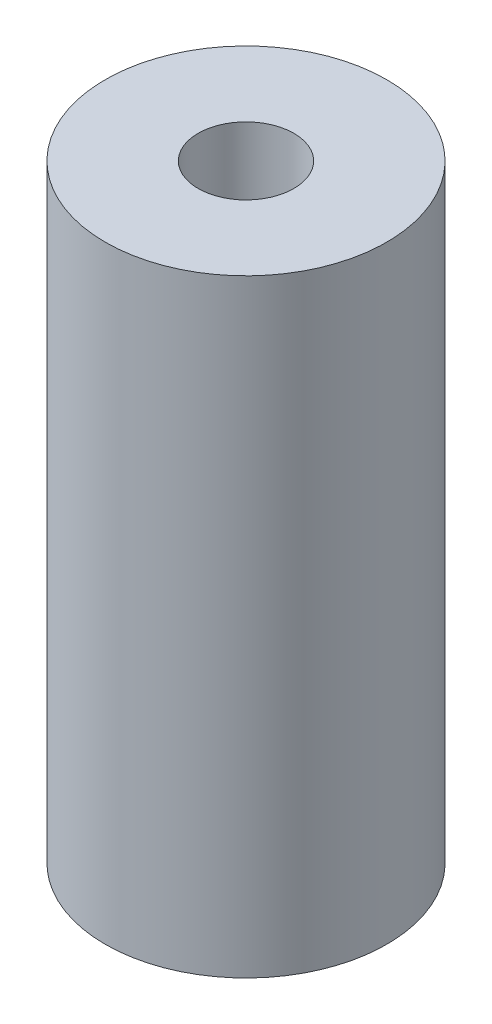
ISO-10303-21;
HEADER;
FILE_DESCRIPTION(('STEP AP214'),'2;1');
FILE_NAME('part.step','',(''),(''),'','','');
FILE_SCHEMA(('AUTOMOTIVE_DESIGN { 1 0 10303 214 1 1 1 1 }'));
ENDSEC;
DATA;
#1=APPLICATION_CONTEXT('core data for automotive mechanical design processes');
#2=APPLICATION_PROTOCOL_DEFINITION('international standard','automotive_design',2000,#1);
#3=PRODUCT_CONTEXT('',#1,'mechanical');
#4=PRODUCT('Part','Part','',(#3));
#5=PRODUCT_RELATED_PRODUCT_CATEGORY('part','',(#4));
#6=PRODUCT_DEFINITION_FORMATION('','',#4);
#7=PRODUCT_DEFINITION_CONTEXT('part definition',#1,'design');
#8=PRODUCT_DEFINITION('design','',#6,#7);
#9=PRODUCT_DEFINITION_SHAPE('','',#8);
#10=(LENGTH_UNIT() NAMED_UNIT(*) SI_UNIT(.MILLI.,.METRE.));
#11=(NAMED_UNIT(*) PLANE_ANGLE_UNIT() SI_UNIT($,.RADIAN.));
#12=(NAMED_UNIT(*) SI_UNIT($,.STERADIAN.) SOLID_ANGLE_UNIT());
#13=UNCERTAINTY_MEASURE_WITH_UNIT(LENGTH_MEASURE(1.E-05),#10,'distance_accuracy_value','');
#14=(GEOMETRIC_REPRESENTATION_CONTEXT(3) GLOBAL_UNCERTAINTY_ASSIGNED_CONTEXT((#13)) GLOBAL_UNIT_ASSIGNED_CONTEXT((#10,
#11,#12)) REPRESENTATION_CONTEXT('',''));
#15=CARTESIAN_POINT('',(0.,0.,0.));
#16=DIRECTION('',(0.,0.,1.));
#17=DIRECTION('',(1.,0.,0.));
#18=AXIS2_PLACEMENT_3D('',#15,#16,#17);
#19=CARTESIAN_POINT('',(12.5087,54.0087,12.5087));
#20=DIRECTION('',(0.,-1.,0.));
#21=DIRECTION('',(0.,0.,-1.));
#22=AXIS2_PLACEMENT_3D('',#19,#20,#21);
#23=CYLINDRICAL_SURFACE('',#22,4.25);
#24=CARTESIAN_POINT('',(12.5087,54.0087,12.5087));
#25=DIRECTION('',(0.,-1.,0.));
#26=DIRECTION('',(0.,0.,-1.));
#27=AXIS2_PLACEMENT_3D('',#24,#25,#26);
#28=CIRCLE('',#27,4.25);
#29=CARTESIAN_POINT('',(12.5087,54.0087,8.2587));
#30=VERTEX_POINT('',#29);
#31=EDGE_CURVE('E26',#30,#30,#28,.F.);
#32=ORIENTED_EDGE('',*,*,#31,.T.);
#33=EDGE_LOOP('',(#32));
#34=FACE_BOUND('',#33,.T.);
#35=CARTESIAN_POINT('',(12.5087,0.00869999999997262,12.5087));
#36=DIRECTION('',(0.,-1.,0.));
#37=DIRECTION('',(0.,0.,-1.));
#38=AXIS2_PLACEMENT_3D('',#35,#36,#37);
#39=CIRCLE('',#38,4.25);
#40=CARTESIAN_POINT('',(12.5087,0.00869999999997262,8.2587));
#41=VERTEX_POINT('',#40);
#42=EDGE_CURVE('E17',#41,#41,#39,.F.);
#43=ORIENTED_EDGE('',*,*,#42,.F.);
#44=EDGE_LOOP('',(#43));
#45=FACE_BOUND('',#44,.T.);
#46=ADVANCED_FACE('F14',(#34,#45),#23,.F.);
#47=CARTESIAN_POINT('',(12.5087,0.008699999999976,12.5087));
#48=DIRECTION('',(0.,-1.,0.));
#49=DIRECTION('',(0.,0.,-1.));
#50=AXIS2_PLACEMENT_3D('',#47,#48,#49);
#51=PLANE('',#50);
#52=ORIENTED_EDGE('',*,*,#42,.T.);
#53=EDGE_LOOP('',(#52));
#54=FACE_BOUND('',#53,.T.);
#55=CARTESIAN_POINT('',(12.5087,0.00869999999997262,12.5087));
#56=DIRECTION('',(0.,-1.,0.));
#57=DIRECTION('',(0.,0.,-1.));
#58=AXIS2_PLACEMENT_3D('',#55,#56,#57);
#59=CIRCLE('',#58,12.5);
#60=CARTESIAN_POINT('',(12.5087,0.00869999999997262,0.00869999999999864));
#61=VERTEX_POINT('',#60);
#62=EDGE_CURVE('E21',#61,#61,#59,.F.);
#63=ORIENTED_EDGE('',*,*,#62,.F.);
#64=EDGE_LOOP('',(#63));
#65=FACE_BOUND('',#64,.T.);
#66=ADVANCED_FACE('F34',(#54,#65),#51,.T.);
#67=CARTESIAN_POINT('',(12.5087,54.0087,12.5087));
#68=DIRECTION('',(0.,-1.,0.));
#69=DIRECTION('',(0.,0.,-1.));
#70=AXIS2_PLACEMENT_3D('',#67,#68,#69);
#71=PLANE('',#70);
#72=ORIENTED_EDGE('',*,*,#31,.F.);
#73=EDGE_LOOP('',(#72));
#74=FACE_BOUND('',#73,.T.);
#75=CARTESIAN_POINT('',(12.5087,54.0087,12.5087));
#76=DIRECTION('',(0.,-1.,0.));
#77=DIRECTION('',(0.,0.,-1.));
#78=AXIS2_PLACEMENT_3D('',#75,#76,#77);
#79=CIRCLE('',#78,12.5);
#80=CARTESIAN_POINT('',(12.5087,54.0087,0.00869999999999864));
#81=VERTEX_POINT('',#80);
#82=EDGE_CURVE('E10',#81,#81,#79,.T.);
#83=ORIENTED_EDGE('',*,*,#82,.F.);
#84=EDGE_LOOP('',(#83));
#85=FACE_BOUND('',#84,.T.);
#86=ADVANCED_FACE('F42',(#74,#85),#71,.F.);
#87=CARTESIAN_POINT('',(12.5087,54.0087,12.5087));
#88=DIRECTION('',(0.,-1.,0.));
#89=DIRECTION('',(0.,0.,-1.));
#90=AXIS2_PLACEMENT_3D('',#87,#88,#89);
#91=CYLINDRICAL_SURFACE('',#90,12.5);
#92=ORIENTED_EDGE('',*,*,#82,.T.);
#93=EDGE_LOOP('',(#92));
#94=FACE_BOUND('',#93,.T.);
#95=ORIENTED_EDGE('',*,*,#62,.T.);
#96=EDGE_LOOP('',(#95));
#97=FACE_BOUND('',#96,.T.);
#98=ADVANCED_FACE('F43',(#94,#97),#91,.T.);
#99=CLOSED_SHELL('',(#46,#66,#86,#98));
#100=MANIFOLD_SOLID_BREP('B1',#99);
#101=ADVANCED_BREP_SHAPE_REPRESENTATION('',(#18,#100),#14);
#102=SHAPE_DEFINITION_REPRESENTATION(#9,#101);
ENDSEC;
END-ISO-10303-21;
